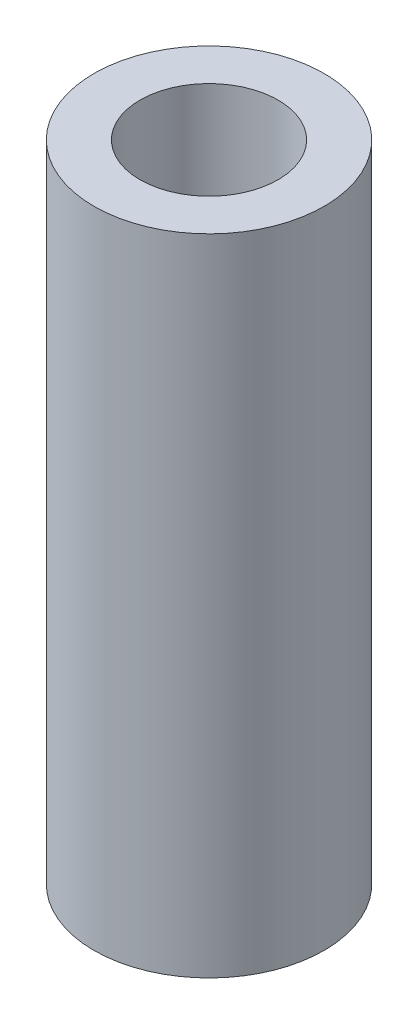
ISO-10303-21;
HEADER;
FILE_DESCRIPTION(('STEP AP214'),'2;1');
FILE_NAME('part.step','',(''),(''),'','','');
FILE_SCHEMA(('AUTOMOTIVE_DESIGN { 1 0 10303 214 1 1 1 1 }'));
ENDSEC;
DATA;
#1=APPLICATION_CONTEXT('core data for automotive mechanical design processes');
#2=APPLICATION_PROTOCOL_DEFINITION('international standard','automotive_design',2000,#1);
#3=PRODUCT_CONTEXT('',#1,'mechanical');
#4=PRODUCT('Part','Part','',(#3));
#5=PRODUCT_RELATED_PRODUCT_CATEGORY('part','',(#4));
#6=PRODUCT_DEFINITION_FORMATION('','',#4);
#7=PRODUCT_DEFINITION_CONTEXT('part definition',#1,'design');
#8=PRODUCT_DEFINITION('design','',#6,#7);
#9=PRODUCT_DEFINITION_SHAPE('','',#8);
#10=(LENGTH_UNIT() NAMED_UNIT(*) SI_UNIT(.MILLI.,.METRE.));
#11=(NAMED_UNIT(*) PLANE_ANGLE_UNIT() SI_UNIT($,.RADIAN.));
#12=(NAMED_UNIT(*) SI_UNIT($,.STERADIAN.) SOLID_ANGLE_UNIT());
#13=UNCERTAINTY_MEASURE_WITH_UNIT(LENGTH_MEASURE(1.E-05),#10,'distance_accuracy_value','');
#14=(GEOMETRIC_REPRESENTATION_CONTEXT(3) GLOBAL_UNCERTAINTY_ASSIGNED_CONTEXT((#13)) GLOBAL_UNIT_ASSIGNED_CONTEXT((#10,
#11,#12)) REPRESENTATION_CONTEXT('',''));
#15=CARTESIAN_POINT('',(0.,0.,0.));
#16=DIRECTION('',(0.,0.,1.));
#17=DIRECTION('',(1.,0.,0.));
#18=AXIS2_PLACEMENT_3D('',#15,#16,#17);
#19=CARTESIAN_POINT('',(0.,14.,0.));
#20=DIRECTION('',(0.,-1.,0.));
#21=DIRECTION('',(0.,0.,-1.));
#22=AXIS2_PLACEMENT_3D('',#19,#20,#21);
#23=CYLINDRICAL_SURFACE('',#22,1.5875);
#24=CARTESIAN_POINT('',(0.,-14.,0.));
#25=DIRECTION('',(0.,1.,0.));
#26=DIRECTION('',(0.,0.,1.));
#27=AXIS2_PLACEMENT_3D('',#24,#25,#26);
#28=CIRCLE('',#27,1.5875);
#29=CARTESIAN_POINT('',(0.,-14.,1.5875));
#30=VERTEX_POINT('',#29);
#31=EDGE_CURVE('E43',#30,#30,#28,.T.);
#32=ORIENTED_EDGE('',*,*,#31,.F.);
#33=EDGE_LOOP('',(#32));
#34=FACE_BOUND('',#33,.T.);
#35=CARTESIAN_POINT('',(0.,2.,0.));
#36=DIRECTION('',(0.,1.,0.));
#37=DIRECTION('',(0.,0.,1.));
#38=AXIS2_PLACEMENT_3D('',#35,#36,#37);
#39=CIRCLE('',#38,1.5875);
#40=CARTESIAN_POINT('',(0.,2.,1.5875));
#41=VERTEX_POINT('',#40);
#42=EDGE_CURVE('E34',#41,#41,#39,.T.);
#43=ORIENTED_EDGE('',*,*,#42,.T.);
#44=EDGE_LOOP('',(#43));
#45=FACE_BOUND('',#44,.T.);
#46=ADVANCED_FACE('F30',(#34,#45),#23,.F.);
#47=CARTESIAN_POINT('',(0.,14.,0.));
#48=DIRECTION('',(0.,1.,0.));
#49=DIRECTION('',(0.,0.,1.));
#50=AXIS2_PLACEMENT_3D('',#47,#48,#49);
#51=PLANE('',#50);
#52=CARTESIAN_POINT('',(0.,14.,0.));
#53=DIRECTION('',(0.,1.,0.));
#54=DIRECTION('',(0.,0.,1.));
#55=AXIS2_PLACEMENT_3D('',#52,#53,#54);
#56=CIRCLE('',#55,3.);
#57=CARTESIAN_POINT('',(0.,14.,3.));
#58=VERTEX_POINT('',#57);
#59=EDGE_CURVE('E47',#58,#58,#56,.T.);
#60=ORIENTED_EDGE('',*,*,#59,.F.);
#61=EDGE_LOOP('',(#60));
#62=FACE_BOUND('',#61,.T.);
#63=CARTESIAN_POINT('',(0.,14.,0.));
#64=DIRECTION('',(0.,1.,0.));
#65=DIRECTION('',(0.,0.,1.));
#66=AXIS2_PLACEMENT_3D('',#63,#64,#65);
#67=CIRCLE('',#66,5.);
#68=CARTESIAN_POINT('',(0.,14.,5.));
#69=VERTEX_POINT('',#68);
#70=EDGE_CURVE('E10',#69,#69,#67,.T.);
#71=ORIENTED_EDGE('',*,*,#70,.T.);
#72=EDGE_LOOP('',(#71));
#73=FACE_BOUND('',#72,.T.);
#74=ADVANCED_FACE('F68',(#62,#73),#51,.T.);
#75=CARTESIAN_POINT('',(0.,-14.,0.));
#76=DIRECTION('',(0.,1.,0.));
#77=DIRECTION('',(0.,0.,1.));
#78=AXIS2_PLACEMENT_3D('',#75,#76,#77);
#79=PLANE('',#78);
#80=CARTESIAN_POINT('',(0.,-14.,0.));
#81=DIRECTION('',(0.,1.,0.));
#82=DIRECTION('',(0.,0.,1.));
#83=AXIS2_PLACEMENT_3D('',#80,#81,#82);
#84=CIRCLE('',#83,5.);
#85=CARTESIAN_POINT('',(0.,-14.,5.));
#86=VERTEX_POINT('',#85);
#87=EDGE_CURVE('E38',#86,#86,#84,.T.);
#88=ORIENTED_EDGE('',*,*,#87,.F.);
#89=EDGE_LOOP('',(#88));
#90=FACE_BOUND('',#89,.T.);
#91=ORIENTED_EDGE('',*,*,#31,.T.);
#92=EDGE_LOOP('',(#91));
#93=FACE_BOUND('',#92,.T.);
#94=ADVANCED_FACE('F74',(#90,#93),#79,.F.);
#95=CARTESIAN_POINT('',(0.,14.,0.));
#96=DIRECTION('',(0.,-1.,0.));
#97=DIRECTION('',(0.,0.,-1.));
#98=AXIS2_PLACEMENT_3D('',#95,#96,#97);
#99=CYLINDRICAL_SURFACE('',#98,5.);
#100=ORIENTED_EDGE('',*,*,#70,.F.);
#101=EDGE_LOOP('',(#100));
#102=FACE_BOUND('',#101,.T.);
#103=ORIENTED_EDGE('',*,*,#87,.T.);
#104=EDGE_LOOP('',(#103));
#105=FACE_BOUND('',#104,.T.);
#106=ADVANCED_FACE('F32',(#102,#105),#99,.T.);
#107=CARTESIAN_POINT('',(0.,2.,0.));
#108=DIRECTION('',(0.,1.,0.));
#109=DIRECTION('',(0.,0.,1.));
#110=AXIS2_PLACEMENT_3D('',#107,#108,#109);
#111=CYLINDRICAL_SURFACE('',#110,3.);
#112=CARTESIAN_POINT('',(0.,2.,0.));
#113=DIRECTION('',(0.,1.,0.));
#114=DIRECTION('',(0.,0.,1.));
#115=AXIS2_PLACEMENT_3D('',#112,#113,#114);
#116=CIRCLE('',#115,3.);
#117=CARTESIAN_POINT('',(0.,2.,3.));
#118=VERTEX_POINT('',#117);
#119=EDGE_CURVE('E50',#118,#118,#116,.T.);
#120=ORIENTED_EDGE('',*,*,#119,.F.);
#121=EDGE_LOOP('',(#120));
#122=FACE_BOUND('',#121,.T.);
#123=ORIENTED_EDGE('',*,*,#59,.T.);
#124=EDGE_LOOP('',(#123));
#125=FACE_BOUND('',#124,.T.);
#126=ADVANCED_FACE('F60',(#122,#125),#111,.F.);
#127=CARTESIAN_POINT('',(0.,2.,0.));
#128=DIRECTION('',(0.,1.,0.));
#129=DIRECTION('',(0.,0.,1.));
#130=AXIS2_PLACEMENT_3D('',#127,#128,#129);
#131=PLANE('',#130);
#132=ORIENTED_EDGE('',*,*,#42,.F.);
#133=EDGE_LOOP('',(#132));
#134=FACE_BOUND('',#133,.T.);
#135=ORIENTED_EDGE('',*,*,#119,.T.);
#136=EDGE_LOOP('',(#135));
#137=FACE_BOUND('',#136,.T.);
#138=ADVANCED_FACE('F58',(#134,#137),#131,.T.);
#139=CLOSED_SHELL('',(#46,#74,#94,#106,#126,#138));
#140=MANIFOLD_SOLID_BREP('B2',#139);
#141=ADVANCED_BREP_SHAPE_REPRESENTATION('',(#18,#140),#14);
#142=SHAPE_DEFINITION_REPRESENTATION(#9,#141);
ENDSEC;
END-ISO-10303-21;
